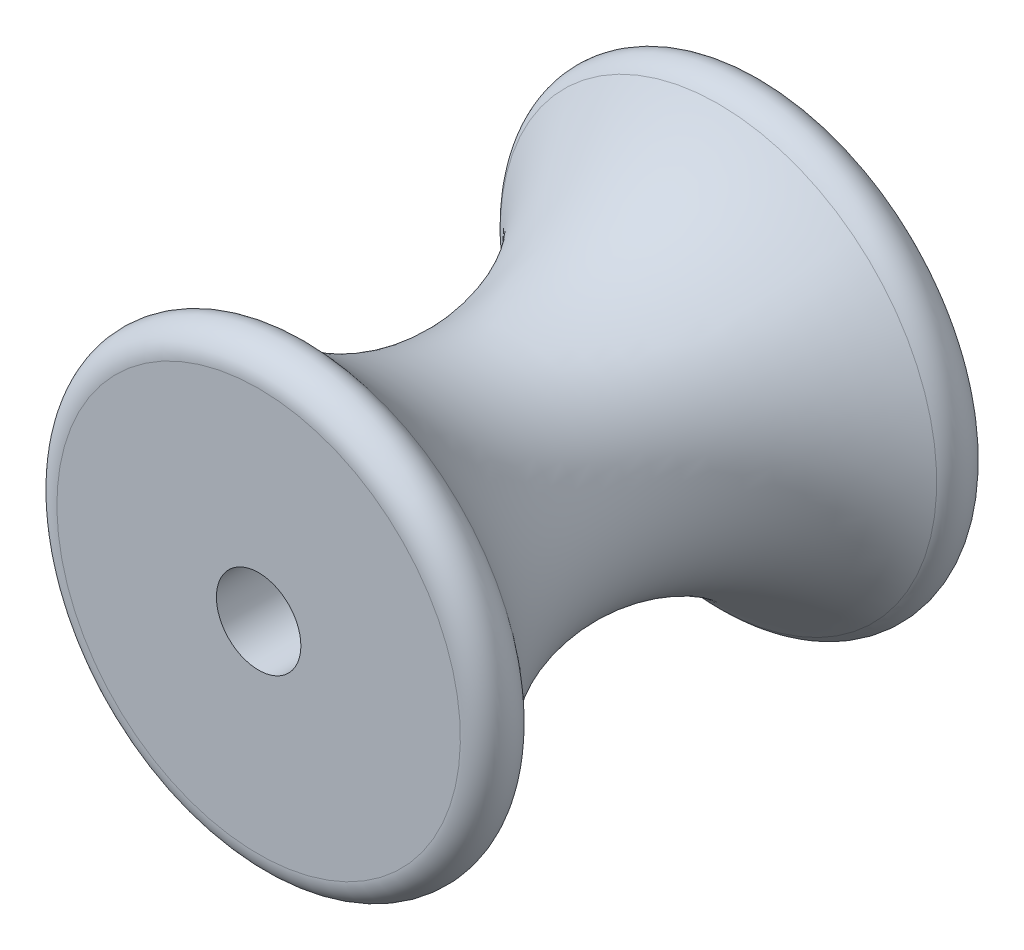
ISO-10303-21;
HEADER;
FILE_DESCRIPTION(('STEP AP214'),'2;1');
FILE_NAME('part.step','',(''),(''),'','','');
FILE_SCHEMA(('AUTOMOTIVE_DESIGN { 1 0 10303 214 1 1 1 1 }'));
ENDSEC;
DATA;
#1=APPLICATION_CONTEXT('core data for automotive mechanical design processes');
#2=APPLICATION_PROTOCOL_DEFINITION('international standard','automotive_design',2000,#1);
#3=PRODUCT_CONTEXT('',#1,'mechanical');
#4=PRODUCT('Part','Part','',(#3));
#5=PRODUCT_RELATED_PRODUCT_CATEGORY('part','',(#4));
#6=PRODUCT_DEFINITION_FORMATION('','',#4);
#7=PRODUCT_DEFINITION_CONTEXT('part definition',#1,'design');
#8=PRODUCT_DEFINITION('design','',#6,#7);
#9=PRODUCT_DEFINITION_SHAPE('','',#8);
#10=(LENGTH_UNIT() NAMED_UNIT(*) SI_UNIT(.MILLI.,.METRE.));
#11=(NAMED_UNIT(*) PLANE_ANGLE_UNIT() SI_UNIT($,.RADIAN.));
#12=(NAMED_UNIT(*) SI_UNIT($,.STERADIAN.) SOLID_ANGLE_UNIT());
#13=UNCERTAINTY_MEASURE_WITH_UNIT(LENGTH_MEASURE(1.E-05),#10,'distance_accuracy_value','');
#14=(GEOMETRIC_REPRESENTATION_CONTEXT(3) GLOBAL_UNCERTAINTY_ASSIGNED_CONTEXT((#13)) GLOBAL_UNIT_ASSIGNED_CONTEXT((#10,
#11,#12)) REPRESENTATION_CONTEXT('',''));
#15=CARTESIAN_POINT('',(0.,0.,0.));
#16=DIRECTION('',(0.,0.,1.));
#17=DIRECTION('',(1.,0.,0.));
#18=AXIS2_PLACEMENT_3D('',#15,#16,#17);
#19=CARTESIAN_POINT('',(0.,0.,-9.6));
#20=DIRECTION('',(0.,0.,-1.));
#21=DIRECTION('',(0.,1.,0.));
#22=AXIS2_PLACEMENT_3D('',#19,#20,#21);
#23=PLANE('',#22);
#24=CARTESIAN_POINT('',(0.,0.,-9.6));
#25=DIRECTION('',(0.,0.,-1.));
#26=DIRECTION('',(0.,1.,0.));
#27=AXIS2_PLACEMENT_3D('',#24,#25,#26);
#28=CIRCLE('',#27,7.64142872020711);
#29=CARTESIAN_POINT('',(0.,7.6414287202071,-9.6));
#30=VERTEX_POINT('',#29);
#31=EDGE_CURVE('E10',#30,#30,#28,.T.);
#32=ORIENTED_EDGE('',*,*,#31,.T.);
#33=EDGE_LOOP('',(#32));
#34=FACE_BOUND('',#33,.T.);
#35=CARTESIAN_POINT('',(0.,0.,-9.6));
#36=DIRECTION('',(0.,0.,-1.));
#37=DIRECTION('',(0.,1.,0.));
#38=AXIS2_PLACEMENT_3D('',#35,#36,#37);
#39=CIRCLE('',#38,1.60000000000001);
#40=CARTESIAN_POINT('',(0.,1.60000000000001,-9.6));
#41=VERTEX_POINT('',#40);
#42=EDGE_CURVE('E62',#41,#41,#39,.T.);
#43=ORIENTED_EDGE('',*,*,#42,.F.);
#44=EDGE_LOOP('',(#43));
#45=FACE_BOUND('',#44,.T.);
#46=ADVANCED_FACE('F39',(#34,#45),#23,.T.);
#47=CARTESIAN_POINT('',(0.,0.,0.));
#48=DIRECTION('',(0.,0.,-1.));
#49=DIRECTION('',(0.,1.,0.));
#50=AXIS2_PLACEMENT_3D('',#47,#48,#49);
#51=TOROIDAL_SURFACE('',#50,14.5,10.);
#52=CARTESIAN_POINT('',(0.,0.,7.81818181818182));
#53=DIRECTION('',(0.,0.,-1.));
#54=DIRECTION('',(0.,1.,0.));
#55=AXIS2_PLACEMENT_3D('',#52,#53,#54);
#56=CIRCLE('',#55,8.26493520018828);
#57=CARTESIAN_POINT('',(0.,8.26493520018827,7.81818181818182));
#58=VERTEX_POINT('',#57);
#59=EDGE_CURVE('E50',#58,#58,#56,.T.);
#60=ORIENTED_EDGE('',*,*,#59,.T.);
#61=EDGE_LOOP('',(#60));
#62=FACE_BOUND('',#61,.T.);
#63=CARTESIAN_POINT('',(0.,0.,-7.81818181818182));
#64=DIRECTION('',(0.,0.,1.));
#65=DIRECTION('',(0.,-1.,0.));
#66=AXIS2_PLACEMENT_3D('',#63,#64,#65);
#67=CIRCLE('',#66,8.26493520018828);
#68=CARTESIAN_POINT('',(0.,-8.26493520018828,-7.81818181818182));
#69=VERTEX_POINT('',#68);
#70=EDGE_CURVE('E54',#69,#69,#67,.T.);
#71=ORIENTED_EDGE('',*,*,#70,.T.);
#72=EDGE_LOOP('',(#71));
#73=FACE_BOUND('',#72,.T.);
#74=ADVANCED_FACE('F69',(#62,#73),#51,.F.);
#75=CARTESIAN_POINT('',(0.,0.,9.6));
#76=DIRECTION('',(0.,0.,-1.));
#77=DIRECTION('',(0.,1.,0.));
#78=AXIS2_PLACEMENT_3D('',#75,#76,#77);
#79=PLANE('',#78);
#80=CARTESIAN_POINT('',(0.,0.,9.6));
#81=DIRECTION('',(0.,0.,-1.));
#82=DIRECTION('',(0.,1.,0.));
#83=AXIS2_PLACEMENT_3D('',#80,#81,#82);
#84=CIRCLE('',#83,7.64142872020711);
#85=CARTESIAN_POINT('',(0.,7.6414287202071,9.6));
#86=VERTEX_POINT('',#85);
#87=EDGE_CURVE('E46',#86,#86,#84,.F.);
#88=ORIENTED_EDGE('',*,*,#87,.T.);
#89=EDGE_LOOP('',(#88));
#90=FACE_BOUND('',#89,.T.);
#91=CARTESIAN_POINT('',(0.,0.,9.6));
#92=DIRECTION('',(0.,0.,-1.));
#93=DIRECTION('',(0.,1.,0.));
#94=AXIS2_PLACEMENT_3D('',#91,#92,#93);
#95=CIRCLE('',#94,1.60000000000001);
#96=CARTESIAN_POINT('',(0.,1.6,9.6));
#97=VERTEX_POINT('',#96);
#98=EDGE_CURVE('E59',#97,#97,#95,.T.);
#99=ORIENTED_EDGE('',*,*,#98,.T.);
#100=EDGE_LOOP('',(#99));
#101=FACE_BOUND('',#100,.T.);
#102=ADVANCED_FACE('F75',(#90,#101),#79,.F.);
#103=CARTESIAN_POINT('',(0.,0.,-10.));
#104=DIRECTION('',(0.,0.,-1.));
#105=DIRECTION('',(0.,1.,0.));
#106=AXIS2_PLACEMENT_3D('',#103,#104,#105);
#107=CYLINDRICAL_SURFACE('',#106,1.60000000000001);
#108=ORIENTED_EDGE('',*,*,#98,.F.);
#109=EDGE_LOOP('',(#108));
#110=FACE_BOUND('',#109,.T.);
#111=ORIENTED_EDGE('',*,*,#42,.T.);
#112=EDGE_LOOP('',(#111));
#113=FACE_BOUND('',#112,.T.);
#114=ADVANCED_FACE('F66',(#110,#113),#107,.F.);
#115=CARTESIAN_POINT('',(0.,0.,8.6));
#116=DIRECTION('',(0.,0.,1.));
#117=DIRECTION('',(0.,-1.,0.));
#118=AXIS2_PLACEMENT_3D('',#115,#116,#117);
#119=TOROIDAL_SURFACE('',#118,7.64142872020711,1.);
#120=ORIENTED_EDGE('',*,*,#87,.F.);
#121=EDGE_LOOP('',(#120));
#122=FACE_BOUND('',#121,.T.);
#123=ORIENTED_EDGE('',*,*,#59,.F.);
#124=EDGE_LOOP('',(#123));
#125=FACE_BOUND('',#124,.T.);
#126=ADVANCED_FACE('F79',(#122,#125),#119,.T.);
#127=CARTESIAN_POINT('',(0.,0.,-8.6));
#128=DIRECTION('',(0.,0.,1.));
#129=DIRECTION('',(0.,-1.,0.));
#130=AXIS2_PLACEMENT_3D('',#127,#128,#129);
#131=TOROIDAL_SURFACE('',#130,7.64142872020711,1.);
#132=ORIENTED_EDGE('',*,*,#70,.F.);
#133=EDGE_LOOP('',(#132));
#134=FACE_BOUND('',#133,.T.);
#135=ORIENTED_EDGE('',*,*,#31,.F.);
#136=EDGE_LOOP('',(#135));
#137=FACE_BOUND('',#136,.T.);
#138=ADVANCED_FACE('F41',(#134,#137),#131,.T.);
#139=CLOSED_SHELL('',(#46,#74,#102,#114,#126,#138));
#140=MANIFOLD_SOLID_BREP('B2',#139);
#141=ADVANCED_BREP_SHAPE_REPRESENTATION('',(#18,#140),#14);
#142=SHAPE_DEFINITION_REPRESENTATION(#9,#141);
ENDSEC;
END-ISO-10303-21;
